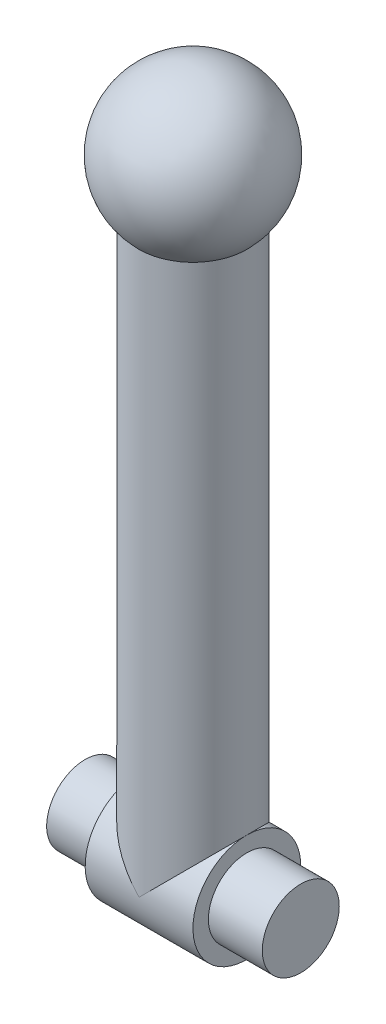
ISO-10303-21;
HEADER;
FILE_DESCRIPTION(('STEP AP214'),'2;1');
FILE_NAME('part.step','',(''),(''),'','','');
FILE_SCHEMA(('AUTOMOTIVE_DESIGN { 1 0 10303 214 1 1 1 1 }'));
ENDSEC;
DATA;
#1=APPLICATION_CONTEXT('core data for automotive mechanical design processes');
#2=APPLICATION_PROTOCOL_DEFINITION('international standard','automotive_design',2000,#1);
#3=PRODUCT_CONTEXT('',#1,'mechanical');
#4=PRODUCT('Part','Part','',(#3));
#5=PRODUCT_RELATED_PRODUCT_CATEGORY('part','',(#4));
#6=PRODUCT_DEFINITION_FORMATION('','',#4);
#7=PRODUCT_DEFINITION_CONTEXT('part definition',#1,'design');
#8=PRODUCT_DEFINITION('design','',#6,#7);
#9=PRODUCT_DEFINITION_SHAPE('','',#8);
#10=(LENGTH_UNIT() NAMED_UNIT(*) SI_UNIT(.MILLI.,.METRE.));
#11=(NAMED_UNIT(*) PLANE_ANGLE_UNIT() SI_UNIT($,.RADIAN.));
#12=(NAMED_UNIT(*) SI_UNIT($,.STERADIAN.) SOLID_ANGLE_UNIT());
#13=UNCERTAINTY_MEASURE_WITH_UNIT(LENGTH_MEASURE(1.E-05),#10,'distance_accuracy_value','');
#14=(GEOMETRIC_REPRESENTATION_CONTEXT(3) GLOBAL_UNCERTAINTY_ASSIGNED_CONTEXT((#13)) GLOBAL_UNIT_ASSIGNED_CONTEXT((#10,
#11,#12)) REPRESENTATION_CONTEXT('',''));
#15=CARTESIAN_POINT('',(0.,0.,0.));
#16=DIRECTION('',(0.,0.,1.));
#17=DIRECTION('',(1.,0.,0.));
#18=AXIS2_PLACEMENT_3D('',#15,#16,#17);
#19=CARTESIAN_POINT('',(-35.,0.,0.));
#20=DIRECTION('',(1.,0.,0.));
#21=DIRECTION('',(0.,0.,-1.));
#22=AXIS2_PLACEMENT_3D('',#19,#20,#21);
#23=CYLINDRICAL_SURFACE('',#22,35.);
#24=CARTESIAN_POINT('',(0.,0.,0.));
#25=DIRECTION('',(0.707106781186547,-0.707106781186547,0.));
#26=DIRECTION('',(-0.707106781186547,-0.707106781186547,0.));
#27=AXIS2_PLACEMENT_3D('',#24,#25,#26);
#28=ELLIPSE('',#27,49.4974746830583,35.);
#29=CARTESIAN_POINT('',(0.,0.,35.));
#30=VERTEX_POINT('',#29);
#31=CARTESIAN_POINT('',(35.,35.,0.));
#32=VERTEX_POINT('',#31);
#33=EDGE_CURVE('E46',#30,#32,#28,.F.);
#34=ORIENTED_EDGE('',*,*,#33,.F.);
#35=CARTESIAN_POINT('',(0.,0.,0.));
#36=DIRECTION('',(-0.707106781186547,-0.707106781186547,0.));
#37=DIRECTION('',(0.707106781186547,-0.707106781186547,0.));
#38=AXIS2_PLACEMENT_3D('',#35,#36,#37);
#39=ELLIPSE('',#38,49.4974746830583,35.);
#40=CARTESIAN_POINT('',(-35.,35.,0.));
#41=VERTEX_POINT('',#40);
#42=EDGE_CURVE('E73',#41,#30,#39,.F.);
#43=ORIENTED_EDGE('',*,*,#42,.F.);
#44=CARTESIAN_POINT('',(-35.,0.,0.));
#45=DIRECTION('',(1.,0.,0.));
#46=DIRECTION('',(0.,0.,-1.));
#47=AXIS2_PLACEMENT_3D('',#44,#45,#46);
#48=CIRCLE('',#47,35.);
#49=EDGE_CURVE('E70',#41,#41,#48,.T.);
#50=ORIENTED_EDGE('',*,*,#49,.T.);
#51=CARTESIAN_POINT('',(0.,0.,-35.));
#52=VERTEX_POINT('',#51);
#53=EDGE_CURVE('E59',#52,#41,#39,.F.);
#54=ORIENTED_EDGE('',*,*,#53,.F.);
#55=EDGE_CURVE('E64',#32,#52,#28,.F.);
#56=ORIENTED_EDGE('',*,*,#55,.F.);
#57=CARTESIAN_POINT('',(35.,0.,0.));
#58=DIRECTION('',(1.,0.,0.));
#59=DIRECTION('',(0.,0.,-1.));
#60=AXIS2_PLACEMENT_3D('',#57,#58,#59);
#61=CIRCLE('',#60,35.);
#62=EDGE_CURVE('E66',#32,#32,#61,.T.);
#63=ORIENTED_EDGE('',*,*,#62,.F.);
#64=EDGE_LOOP('',(#34,#43,#50,#54,#56,#63));
#65=FACE_BOUND('',#64,.T.);
#66=ADVANCED_FACE('F38',(#65),#23,.T.);
#67=CARTESIAN_POINT('',(-35.,0.,0.));
#68=DIRECTION('',(1.,0.,0.));
#69=DIRECTION('',(0.,0.,-1.));
#70=AXIS2_PLACEMENT_3D('',#67,#68,#69);
#71=PLANE('',#70);
#72=CARTESIAN_POINT('',(-35.,0.,0.));
#73=DIRECTION('',(1.,0.,0.));
#74=DIRECTION('',(0.,0.,-1.));
#75=AXIS2_PLACEMENT_3D('',#72,#73,#74);
#76=CIRCLE('',#75,25.);
#77=CARTESIAN_POINT('',(-35.,0.,-25.));
#78=VERTEX_POINT('',#77);
#79=EDGE_CURVE('E120',#78,#78,#76,.T.);
#80=ORIENTED_EDGE('',*,*,#79,.T.);
#81=EDGE_LOOP('',(#80));
#82=FACE_BOUND('',#81,.T.);
#83=ORIENTED_EDGE('',*,*,#49,.F.);
#84=EDGE_LOOP('',(#83));
#85=FACE_BOUND('',#84,.T.);
#86=ADVANCED_FACE('F95',(#82,#85),#71,.F.);
#87=CARTESIAN_POINT('',(35.,0.,0.));
#88=DIRECTION('',(1.,0.,0.));
#89=DIRECTION('',(0.,0.,-1.));
#90=AXIS2_PLACEMENT_3D('',#87,#88,#89);
#91=PLANE('',#90);
#92=CARTESIAN_POINT('',(35.,0.,0.));
#93=DIRECTION('',(1.,0.,0.));
#94=DIRECTION('',(0.,0.,-1.));
#95=AXIS2_PLACEMENT_3D('',#92,#93,#94);
#96=CIRCLE('',#95,25.);
#97=CARTESIAN_POINT('',(35.,0.,-25.));
#98=VERTEX_POINT('',#97);
#99=EDGE_CURVE('E76',#98,#98,#96,.T.);
#100=ORIENTED_EDGE('',*,*,#99,.F.);
#101=EDGE_LOOP('',(#100));
#102=FACE_BOUND('',#101,.T.);
#103=ORIENTED_EDGE('',*,*,#62,.T.);
#104=EDGE_LOOP('',(#103));
#105=FACE_BOUND('',#104,.T.);
#106=ADVANCED_FACE('F69',(#102,#105),#91,.T.);
#107=CARTESIAN_POINT('',(0.,400.,0.));
#108=DIRECTION('',(0.,-1.,0.));
#109=DIRECTION('',(0.,0.,-1.));
#110=AXIS2_PLACEMENT_3D('',#107,#108,#109);
#111=CYLINDRICAL_SURFACE('',#110,35.);
#112=ORIENTED_EDGE('',*,*,#42,.T.);
#113=ORIENTED_EDGE('',*,*,#33,.T.);
#114=ORIENTED_EDGE('',*,*,#55,.T.);
#115=ORIENTED_EDGE('',*,*,#53,.T.);
#116=EDGE_LOOP('',(#112,#113,#114,#115));
#117=FACE_BOUND('',#116,.T.);
#118=CARTESIAN_POINT('',(0.,364.292857857286,0.));
#119=DIRECTION('',(0.,1.,0.));
#120=DIRECTION('',(0.,0.,1.));
#121=AXIS2_PLACEMENT_3D('',#118,#119,#120);
#122=CIRCLE('',#121,35.);
#123=CARTESIAN_POINT('',(0.,364.292857857286,35.));
#124=VERTEX_POINT('',#123);
#125=EDGE_CURVE('E11',#124,#124,#122,.T.);
#126=ORIENTED_EDGE('',*,*,#125,.F.);
#127=EDGE_LOOP('',(#126));
#128=FACE_BOUND('',#127,.T.);
#129=ADVANCED_FACE('F40',(#117,#128),#111,.T.);
#130=CARTESIAN_POINT('',(0.,400.,0.));
#131=DIRECTION('',(0.,0.,-1.));
#132=DIRECTION('',(1.,0.,0.));
#133=AXIS2_PLACEMENT_3D('',#130,#131,#132);
#134=SPHERICAL_SURFACE('',#133,50.);
#135=CARTESIAN_POINT('',(0.,400.,0.));
#136=DIRECTION('',(0.,1.,0.));
#137=DIRECTION('',(0.,0.,1.));
#138=AXIS2_PLACEMENT_3D('',#135,#136,#137);
#139=SPHERICAL_SURFACE('',#138,50.);
#140=ORIENTED_EDGE('',*,*,#125,.T.);
#141=EDGE_LOOP('',(#140));
#142=FACE_BOUND('',#141,.T.);
#143=ADVANCED_FACE('F82',(#142),#139,.T.);
#144=CARTESIAN_POINT('',(70.,0.,0.));
#145=DIRECTION('',(-1.,0.,0.));
#146=DIRECTION('',(0.,0.,1.));
#147=AXIS2_PLACEMENT_3D('',#144,#145,#146);
#148=CYLINDRICAL_SURFACE('',#147,25.);
#149=CARTESIAN_POINT('',(70.,0.,0.));
#150=DIRECTION('',(1.,0.,0.));
#151=DIRECTION('',(0.,0.,-1.));
#152=AXIS2_PLACEMENT_3D('',#149,#150,#151);
#153=CIRCLE('',#152,25.);
#154=CARTESIAN_POINT('',(70.,0.,-25.));
#155=VERTEX_POINT('',#154);
#156=EDGE_CURVE('E71',#155,#155,#153,.T.);
#157=ORIENTED_EDGE('',*,*,#156,.F.);
#158=EDGE_LOOP('',(#157));
#159=FACE_BOUND('',#158,.T.);
#160=ORIENTED_EDGE('',*,*,#99,.T.);
#161=EDGE_LOOP('',(#160));
#162=FACE_BOUND('',#161,.T.);
#163=ADVANCED_FACE('F86',(#159,#162),#148,.T.);
#164=CARTESIAN_POINT('',(70.,0.,0.));
#165=DIRECTION('',(1.,0.,0.));
#166=DIRECTION('',(0.,0.,-1.));
#167=AXIS2_PLACEMENT_3D('',#164,#165,#166);
#168=PLANE('',#167);
#169=ORIENTED_EDGE('',*,*,#156,.T.);
#170=EDGE_LOOP('',(#169));
#171=FACE_BOUND('',#170,.T.);
#172=ADVANCED_FACE('F90',(#171),#168,.T.);
#173=CARTESIAN_POINT('',(-70.,0.,0.));
#174=DIRECTION('',(1.,0.,0.));
#175=DIRECTION('',(0.,0.,-1.));
#176=AXIS2_PLACEMENT_3D('',#173,#174,#175);
#177=CYLINDRICAL_SURFACE('',#176,25.);
#178=CARTESIAN_POINT('',(-70.,0.,0.));
#179=DIRECTION('',(1.,0.,0.));
#180=DIRECTION('',(0.,0.,-1.));
#181=AXIS2_PLACEMENT_3D('',#178,#179,#180);
#182=CIRCLE('',#181,25.);
#183=CARTESIAN_POINT('',(-70.,0.,-25.));
#184=VERTEX_POINT('',#183);
#185=EDGE_CURVE('E119',#184,#184,#182,.T.);
#186=ORIENTED_EDGE('',*,*,#185,.T.);
#187=EDGE_LOOP('',(#186));
#188=FACE_BOUND('',#187,.T.);
#189=ORIENTED_EDGE('',*,*,#79,.F.);
#190=EDGE_LOOP('',(#189));
#191=FACE_BOUND('',#190,.T.);
#192=ADVANCED_FACE('F107',(#188,#191),#177,.T.);
#193=CARTESIAN_POINT('',(-70.,0.,0.));
#194=DIRECTION('',(-1.,0.,0.));
#195=DIRECTION('',(0.,0.,-1.));
#196=AXIS2_PLACEMENT_3D('',#193,#194,#195);
#197=PLANE('',#196);
#198=ORIENTED_EDGE('',*,*,#185,.F.);
#199=EDGE_LOOP('',(#198));
#200=FACE_BOUND('',#199,.T.);
#201=ADVANCED_FACE('F111',(#200),#197,.T.);
#202=CLOSED_SHELL('',(#66,#86,#106,#129,#143,#163,#172,#192,#201));
#203=MANIFOLD_SOLID_BREP('B2',#202);
#204=ADVANCED_BREP_SHAPE_REPRESENTATION('',(#18,#203),#14);
#205=SHAPE_DEFINITION_REPRESENTATION(#9,#204);
ENDSEC;
END-ISO-10303-21;
